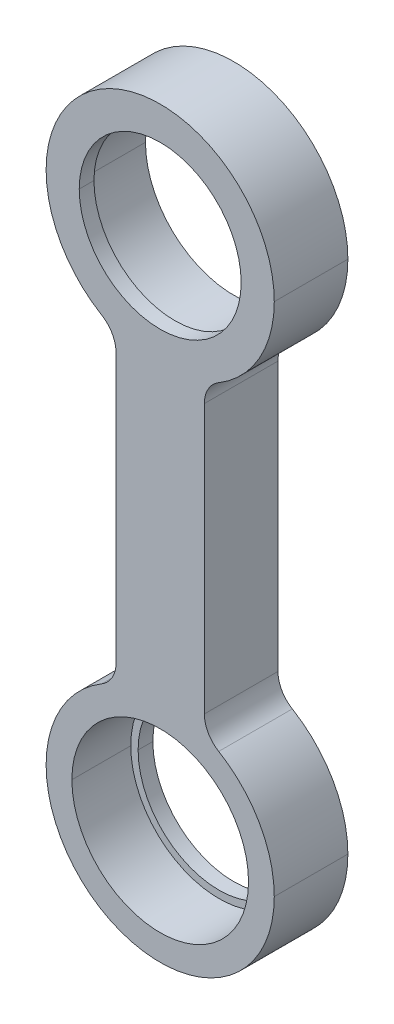
ISO-10303-21;
HEADER;
FILE_DESCRIPTION(('STEP AP214'),'2;1');
FILE_NAME('part.step','',(''),(''),'','','');
FILE_SCHEMA(('AUTOMOTIVE_DESIGN { 1 0 10303 214 1 1 1 1 }'));
ENDSEC;
DATA;
#1=APPLICATION_CONTEXT('core data for automotive mechanical design processes');
#2=APPLICATION_PROTOCOL_DEFINITION('international standard','automotive_design',2000,#1);
#3=PRODUCT_CONTEXT('',#1,'mechanical');
#4=PRODUCT('Part','Part','',(#3));
#5=PRODUCT_RELATED_PRODUCT_CATEGORY('part','',(#4));
#6=PRODUCT_DEFINITION_FORMATION('','',#4);
#7=PRODUCT_DEFINITION_CONTEXT('part definition',#1,'design');
#8=PRODUCT_DEFINITION('design','',#6,#7);
#9=PRODUCT_DEFINITION_SHAPE('','',#8);
#10=(LENGTH_UNIT() NAMED_UNIT(*) SI_UNIT(.MILLI.,.METRE.));
#11=(NAMED_UNIT(*) PLANE_ANGLE_UNIT() SI_UNIT($,.RADIAN.));
#12=(NAMED_UNIT(*) SI_UNIT($,.STERADIAN.) SOLID_ANGLE_UNIT());
#13=UNCERTAINTY_MEASURE_WITH_UNIT(LENGTH_MEASURE(1.E-05),#10,'distance_accuracy_value','');
#14=(GEOMETRIC_REPRESENTATION_CONTEXT(3) GLOBAL_UNCERTAINTY_ASSIGNED_CONTEXT((#13)) GLOBAL_UNIT_ASSIGNED_CONTEXT((#10,
#11,#12)) REPRESENTATION_CONTEXT('',''));
#15=CARTESIAN_POINT('',(0.,0.,0.));
#16=DIRECTION('',(0.,0.,1.));
#17=DIRECTION('',(1.,0.,0.));
#18=AXIS2_PLACEMENT_3D('',#15,#16,#17);
#19=CARTESIAN_POINT('',(0.,0.,1.));
#20=DIRECTION('',(0.,0.,-1.));
#21=DIRECTION('',(-1.,0.,0.));
#22=AXIS2_PLACEMENT_3D('',#19,#20,#21);
#23=CYLINDRICAL_SURFACE('',#22,5.5);
#24=DIRECTION('',(0.,0.,-1.));
#25=VECTOR('',#24,1.);
#26=CARTESIAN_POINT('',(5.5,0.,1.));
#27=LINE('',#26,#25);
#28=CARTESIAN_POINT('',(5.5,0.,1.));
#29=VERTEX_POINT('',#28);
#30=CARTESIAN_POINT('',(5.5,0.,0.));
#31=VERTEX_POINT('',#30);
#32=EDGE_CURVE('E444',#29,#31,#27,.T.);
#33=ORIENTED_EDGE('',*,*,#32,.F.);
#34=CARTESIAN_POINT('',(0.,0.,1.));
#35=DIRECTION('',(0.,0.,-1.));
#36=DIRECTION('',(-1.,0.,0.));
#37=AXIS2_PLACEMENT_3D('',#34,#35,#36);
#38=CIRCLE('',#37,5.5);
#39=CARTESIAN_POINT('',(-5.5,0.,1.));
#40=VERTEX_POINT('',#39);
#41=EDGE_CURVE('E9',#40,#29,#38,.T.);
#42=ORIENTED_EDGE('',*,*,#41,.F.);
#43=DIRECTION('',(0.,0.,-1.));
#44=VECTOR('',#43,1.);
#45=CARTESIAN_POINT('',(-5.5,0.,1.));
#46=LINE('',#45,#44);
#47=CARTESIAN_POINT('',(-5.5,0.,0.));
#48=VERTEX_POINT('',#47);
#49=EDGE_CURVE('E375',#40,#48,#46,.T.);
#50=ORIENTED_EDGE('',*,*,#49,.T.);
#51=CARTESIAN_POINT('',(0.,0.,0.));
#52=DIRECTION('',(0.,0.,-1.));
#53=DIRECTION('',(-1.,0.,0.));
#54=AXIS2_PLACEMENT_3D('',#51,#52,#53);
#55=CIRCLE('',#54,5.5);
#56=EDGE_CURVE('E339',#48,#31,#55,.T.);
#57=ORIENTED_EDGE('',*,*,#56,.T.);
#58=EDGE_LOOP('',(#33,#42,#50,#57));
#59=FACE_BOUND('',#58,.T.);
#60=ADVANCED_FACE('F15',(#59),#23,.F.);
#61=CARTESIAN_POINT('',(0.,0.,1.));
#62=DIRECTION('',(0.,0.,-1.));
#63=DIRECTION('',(0.,-1.,0.));
#64=AXIS2_PLACEMENT_3D('',#61,#62,#63);
#65=PLANE('',#64);
#66=ORIENTED_EDGE('',*,*,#41,.T.);
#67=CARTESIAN_POINT('',(0.,0.,1.));
#68=DIRECTION('',(0.,0.,-1.));
#69=DIRECTION('',(-1.,0.,0.));
#70=AXIS2_PLACEMENT_3D('',#67,#68,#69);
#71=CIRCLE('',#70,5.5);
#72=EDGE_CURVE('E440',#29,#40,#71,.T.);
#73=ORIENTED_EDGE('',*,*,#72,.T.);
#74=EDGE_LOOP('',(#66,#73));
#75=FACE_BOUND('',#74,.T.);
#76=CARTESIAN_POINT('',(0.,0.,1.));
#77=DIRECTION('',(0.,0.,-1.));
#78=DIRECTION('',(-1.,0.,0.));
#79=AXIS2_PLACEMENT_3D('',#76,#77,#78);
#80=CIRCLE('',#79,6.);
#81=CARTESIAN_POINT('',(-6.,0.,1.));
#82=VERTEX_POINT('',#81);
#83=CARTESIAN_POINT('',(6.,0.,1.));
#84=VERTEX_POINT('',#83);
#85=EDGE_CURVE('E277',#82,#84,#80,.T.);
#86=ORIENTED_EDGE('',*,*,#85,.F.);
#87=CARTESIAN_POINT('',(0.,0.,1.));
#88=DIRECTION('',(0.,0.,-1.));
#89=DIRECTION('',(-1.,0.,0.));
#90=AXIS2_PLACEMENT_3D('',#87,#88,#89);
#91=CIRCLE('',#90,6.);
#92=EDGE_CURVE('E267',#84,#82,#91,.T.);
#93=ORIENTED_EDGE('',*,*,#92,.F.);
#94=EDGE_LOOP('',(#86,#93));
#95=FACE_BOUND('',#94,.T.);
#96=ADVANCED_FACE('F469',(#75,#95),#65,.F.);
#97=CARTESIAN_POINT('',(0.,35.,4.));
#98=DIRECTION('',(0.,0.,1.));
#99=DIRECTION('',(1.,0.,0.));
#100=AXIS2_PLACEMENT_3D('',#97,#98,#99);
#101=CYLINDRICAL_SURFACE('',#100,5.5);
#102=DIRECTION('',(0.,0.,1.));
#103=VECTOR('',#102,1.);
#104=CARTESIAN_POINT('',(-5.5,35.,4.));
#105=LINE('',#104,#103);
#106=CARTESIAN_POINT('',(-5.5,35.,4.));
#107=VERTEX_POINT('',#106);
#108=CARTESIAN_POINT('',(-5.5,35.,5.));
#109=VERTEX_POINT('',#108);
#110=EDGE_CURVE('E364',#107,#109,#105,.T.);
#111=ORIENTED_EDGE('',*,*,#110,.F.);
#112=CARTESIAN_POINT('',(0.,35.,4.));
#113=DIRECTION('',(0.,0.,1.));
#114=DIRECTION('',(1.,0.,0.));
#115=AXIS2_PLACEMENT_3D('',#112,#113,#114);
#116=CIRCLE('',#115,5.5);
#117=CARTESIAN_POINT('',(5.5,35.,4.));
#118=VERTEX_POINT('',#117);
#119=EDGE_CURVE('E18',#118,#107,#116,.T.);
#120=ORIENTED_EDGE('',*,*,#119,.F.);
#121=DIRECTION('',(0.,0.,1.));
#122=VECTOR('',#121,1.);
#123=CARTESIAN_POINT('',(5.5,35.,4.));
#124=LINE('',#123,#122);
#125=CARTESIAN_POINT('',(5.5,35.,5.));
#126=VERTEX_POINT('',#125);
#127=EDGE_CURVE('E373',#118,#126,#124,.T.);
#128=ORIENTED_EDGE('',*,*,#127,.T.);
#129=CARTESIAN_POINT('',(0.,35.,5.));
#130=DIRECTION('',(0.,0.,1.));
#131=DIRECTION('',(1.,0.,0.));
#132=AXIS2_PLACEMENT_3D('',#129,#130,#131);
#133=CIRCLE('',#132,5.5);
#134=EDGE_CURVE('E308',#126,#109,#133,.T.);
#135=ORIENTED_EDGE('',*,*,#134,.T.);
#136=EDGE_LOOP('',(#111,#120,#128,#135));
#137=FACE_BOUND('',#136,.T.);
#138=ADVANCED_FACE('F365',(#137),#101,.F.);
#139=CARTESIAN_POINT('',(0.,35.,4.));
#140=DIRECTION('',(0.,0.,1.));
#141=DIRECTION('',(1.,0.,0.));
#142=AXIS2_PLACEMENT_3D('',#139,#140,#141);
#143=PLANE('',#142);
#144=ORIENTED_EDGE('',*,*,#119,.T.);
#145=CARTESIAN_POINT('',(0.,35.,4.));
#146=DIRECTION('',(0.,0.,1.));
#147=DIRECTION('',(1.,0.,0.));
#148=AXIS2_PLACEMENT_3D('',#145,#146,#147);
#149=CIRCLE('',#148,5.5);
#150=EDGE_CURVE('E359',#107,#118,#149,.T.);
#151=ORIENTED_EDGE('',*,*,#150,.T.);
#152=EDGE_LOOP('',(#144,#151));
#153=FACE_BOUND('',#152,.T.);
#154=CARTESIAN_POINT('',(0.,35.,4.));
#155=DIRECTION('',(0.,0.,1.));
#156=DIRECTION('',(1.,0.,0.));
#157=AXIS2_PLACEMENT_3D('',#154,#155,#156);
#158=CIRCLE('',#157,6.);
#159=CARTESIAN_POINT('',(-6.,35.,4.));
#160=VERTEX_POINT('',#159);
#161=CARTESIAN_POINT('',(6.,35.,4.));
#162=VERTEX_POINT('',#161);
#163=EDGE_CURVE('E243',#160,#162,#158,.T.);
#164=ORIENTED_EDGE('',*,*,#163,.F.);
#165=CARTESIAN_POINT('',(0.,35.,4.));
#166=DIRECTION('',(0.,0.,1.));
#167=DIRECTION('',(1.,0.,0.));
#168=AXIS2_PLACEMENT_3D('',#165,#166,#167);
#169=CIRCLE('',#168,6.);
#170=EDGE_CURVE('E280',#162,#160,#169,.T.);
#171=ORIENTED_EDGE('',*,*,#170,.F.);
#172=EDGE_LOOP('',(#164,#171));
#173=FACE_BOUND('',#172,.T.);
#174=ADVANCED_FACE('F356',(#153,#173),#143,.F.);
#175=CARTESIAN_POINT('',(-5.,8.3703345213916,5.));
#176=DIRECTION('',(0.,0.,-1.));
#177=DIRECTION('',(-1.,0.,0.));
#178=AXIS2_PLACEMENT_3D('',#175,#176,#177);
#179=CYLINDRICAL_SURFACE('',#178,2.);
#180=CARTESIAN_POINT('',(-5.,8.3703345213916,5.));
#181=DIRECTION('',(0.,0.,-1.));
#182=DIRECTION('',(1.,0.,0.));
#183=AXIS2_PLACEMENT_3D('',#180,#181,#182);
#184=CIRCLE('',#183,2.);
#185=CARTESIAN_POINT('',(-3.,8.3703345213916,5.));
#186=VERTEX_POINT('',#185);
#187=CARTESIAN_POINT('',(-3.97435897435898,6.65334282469589,5.));
#188=VERTEX_POINT('',#187);
#189=EDGE_CURVE('E294',#186,#188,#184,.T.);
#190=ORIENTED_EDGE('',*,*,#189,.F.);
#191=DIRECTION('',(0.,0.,1.));
#192=VECTOR('',#191,1.);
#193=CARTESIAN_POINT('',(-3.,8.3703345213916,5.));
#194=LINE('',#193,#192);
#195=CARTESIAN_POINT('',(-3.,8.3703345213916,0.));
#196=VERTEX_POINT('',#195);
#197=EDGE_CURVE('E48',#196,#186,#194,.T.);
#198=ORIENTED_EDGE('',*,*,#197,.F.);
#199=CARTESIAN_POINT('',(-5.,8.3703345213916,0.));
#200=DIRECTION('',(0.,0.,1.));
#201=DIRECTION('',(1.,0.,0.));
#202=AXIS2_PLACEMENT_3D('',#199,#200,#201);
#203=CIRCLE('',#202,2.);
#204=CARTESIAN_POINT('',(-3.97435897435898,6.65334282469589,0.));
#205=VERTEX_POINT('',#204);
#206=EDGE_CURVE('E330',#205,#196,#203,.T.);
#207=ORIENTED_EDGE('',*,*,#206,.F.);
#208=DIRECTION('',(0.,0.,-1.));
#209=VECTOR('',#208,1.);
#210=CARTESIAN_POINT('',(-3.97435897435898,6.65334282469589,5.));
#211=LINE('',#210,#209);
#212=EDGE_CURVE('E316',#188,#205,#211,.T.);
#213=ORIENTED_EDGE('',*,*,#212,.F.);
#214=EDGE_LOOP('',(#190,#198,#207,#213));
#215=FACE_BOUND('',#214,.T.);
#216=ADVANCED_FACE('F482',(#215),#179,.F.);
#217=CARTESIAN_POINT('',(5.,8.3703345213916,5.));
#218=DIRECTION('',(0.,0.,-1.));
#219=DIRECTION('',(-1.,0.,0.));
#220=AXIS2_PLACEMENT_3D('',#217,#218,#219);
#221=CYLINDRICAL_SURFACE('',#220,2.);
#222=CARTESIAN_POINT('',(5.,8.3703345213916,5.));
#223=DIRECTION('',(0.,0.,-1.));
#224=DIRECTION('',(1.,0.,0.));
#225=AXIS2_PLACEMENT_3D('',#222,#223,#224);
#226=CIRCLE('',#225,2.);
#227=CARTESIAN_POINT('',(3.97435897435898,6.65334282469589,5.));
#228=VERTEX_POINT('',#227);
#229=CARTESIAN_POINT('',(3.,8.3703345213916,5.));
#230=VERTEX_POINT('',#229);
#231=EDGE_CURVE('E293',#228,#230,#226,.T.);
#232=ORIENTED_EDGE('',*,*,#231,.F.);
#233=DIRECTION('',(0.,0.,1.));
#234=VECTOR('',#233,1.);
#235=CARTESIAN_POINT('',(3.97435897435898,6.65334282469589,5.));
#236=LINE('',#235,#234);
#237=CARTESIAN_POINT('',(3.97435897435898,6.65334282469589,0.));
#238=VERTEX_POINT('',#237);
#239=EDGE_CURVE('E388',#238,#228,#236,.T.);
#240=ORIENTED_EDGE('',*,*,#239,.F.);
#241=CARTESIAN_POINT('',(5.,8.3703345213916,0.));
#242=DIRECTION('',(0.,0.,1.));
#243=DIRECTION('',(1.,0.,0.));
#244=AXIS2_PLACEMENT_3D('',#241,#242,#243);
#245=CIRCLE('',#244,2.);
#246=CARTESIAN_POINT('',(3.,8.3703345213916,0.));
#247=VERTEX_POINT('',#246);
#248=EDGE_CURVE('E272',#247,#238,#245,.T.);
#249=ORIENTED_EDGE('',*,*,#248,.F.);
#250=DIRECTION('',(0.,0.,-1.));
#251=VECTOR('',#250,1.);
#252=CARTESIAN_POINT('',(3.,8.3703345213916,0.));
#253=LINE('',#252,#251);
#254=EDGE_CURVE('E315',#230,#247,#253,.T.);
#255=ORIENTED_EDGE('',*,*,#254,.F.);
#256=EDGE_LOOP('',(#232,#240,#249,#255));
#257=FACE_BOUND('',#256,.T.);
#258=ADVANCED_FACE('F485',(#257),#221,.F.);
#259=CARTESIAN_POINT('',(5.,26.6296654786084,5.));
#260=DIRECTION('',(0.,0.,-1.));
#261=DIRECTION('',(-1.,0.,0.));
#262=AXIS2_PLACEMENT_3D('',#259,#260,#261);
#263=CYLINDRICAL_SURFACE('',#262,2.);
#264=CARTESIAN_POINT('',(5.,26.6296654786084,5.));
#265=DIRECTION('',(0.,0.,-1.));
#266=DIRECTION('',(1.,0.,0.));
#267=AXIS2_PLACEMENT_3D('',#264,#265,#266);
#268=CIRCLE('',#267,2.);
#269=CARTESIAN_POINT('',(3.,26.6296654786084,5.));
#270=VERTEX_POINT('',#269);
#271=CARTESIAN_POINT('',(3.97435897435898,28.3466571753041,5.));
#272=VERTEX_POINT('',#271);
#273=EDGE_CURVE('E289',#270,#272,#268,.T.);
#274=ORIENTED_EDGE('',*,*,#273,.F.);
#275=DIRECTION('',(0.,0.,1.));
#276=VECTOR('',#275,1.);
#277=CARTESIAN_POINT('',(3.,26.6296654786084,5.));
#278=LINE('',#277,#276);
#279=CARTESIAN_POINT('',(3.,26.6296654786084,0.));
#280=VERTEX_POINT('',#279);
#281=EDGE_CURVE('E312',#280,#270,#278,.T.);
#282=ORIENTED_EDGE('',*,*,#281,.F.);
#283=CARTESIAN_POINT('',(5.,26.6296654786084,0.));
#284=DIRECTION('',(0.,0.,1.));
#285=DIRECTION('',(1.,0.,0.));
#286=AXIS2_PLACEMENT_3D('',#283,#284,#285);
#287=CIRCLE('',#286,2.);
#288=CARTESIAN_POINT('',(3.97435897435898,28.3466571753041,0.));
#289=VERTEX_POINT('',#288);
#290=EDGE_CURVE('E319',#289,#280,#287,.T.);
#291=ORIENTED_EDGE('',*,*,#290,.F.);
#292=DIRECTION('',(0.,0.,-1.));
#293=VECTOR('',#292,1.);
#294=CARTESIAN_POINT('',(3.97435897435898,28.3466571753041,5.));
#295=LINE('',#294,#293);
#296=EDGE_CURVE('E341',#272,#289,#295,.T.);
#297=ORIENTED_EDGE('',*,*,#296,.F.);
#298=EDGE_LOOP('',(#274,#282,#291,#297));
#299=FACE_BOUND('',#298,.T.);
#300=ADVANCED_FACE('F488',(#299),#263,.F.);
#301=CARTESIAN_POINT('',(-5.,26.6296654786084,5.));
#302=DIRECTION('',(0.,0.,-1.));
#303=DIRECTION('',(-1.,0.,0.));
#304=AXIS2_PLACEMENT_3D('',#301,#302,#303);
#305=CYLINDRICAL_SURFACE('',#304,2.);
#306=CARTESIAN_POINT('',(-5.,26.6296654786084,5.));
#307=DIRECTION('',(0.,0.,-1.));
#308=DIRECTION('',(1.,0.,0.));
#309=AXIS2_PLACEMENT_3D('',#306,#307,#308);
#310=CIRCLE('',#309,2.);
#311=CARTESIAN_POINT('',(-3.97435897435898,28.3466571753041,5.));
#312=VERTEX_POINT('',#311);
#313=CARTESIAN_POINT('',(-3.,26.6296654786084,5.));
#314=VERTEX_POINT('',#313);
#315=EDGE_CURVE('E288',#312,#314,#310,.T.);
#316=ORIENTED_EDGE('',*,*,#315,.F.);
#317=DIRECTION('',(0.,0.,1.));
#318=VECTOR('',#317,1.);
#319=CARTESIAN_POINT('',(-3.97435897435898,28.3466571753041,5.));
#320=LINE('',#319,#318);
#321=CARTESIAN_POINT('',(-3.97435897435898,28.3466571753041,0.));
#322=VERTEX_POINT('',#321);
#323=EDGE_CURVE('E215',#322,#312,#320,.T.);
#324=ORIENTED_EDGE('',*,*,#323,.F.);
#325=CARTESIAN_POINT('',(-5.,26.6296654786084,0.));
#326=DIRECTION('',(0.,0.,1.));
#327=DIRECTION('',(1.,0.,0.));
#328=AXIS2_PLACEMENT_3D('',#325,#326,#327);
#329=CIRCLE('',#328,2.);
#330=CARTESIAN_POINT('',(-3.,26.6296654786084,0.));
#331=VERTEX_POINT('',#330);
#332=EDGE_CURVE('E210',#331,#322,#329,.T.);
#333=ORIENTED_EDGE('',*,*,#332,.F.);
#334=DIRECTION('',(0.,0.,-1.));
#335=VECTOR('',#334,1.);
#336=CARTESIAN_POINT('',(-3.,26.6296654786084,0.));
#337=LINE('',#336,#335);
#338=EDGE_CURVE('E37',#314,#331,#337,.T.);
#339=ORIENTED_EDGE('',*,*,#338,.F.);
#340=EDGE_LOOP('',(#316,#324,#333,#339));
#341=FACE_BOUND('',#340,.T.);
#342=ADVANCED_FACE('F492',(#341),#305,.F.);
#343=CARTESIAN_POINT('',(3.,7.14580296397823,5.));
#344=DIRECTION('',(-1.,0.,0.));
#345=DIRECTION('',(0.,0.,1.));
#346=AXIS2_PLACEMENT_3D('',#343,#344,#345);
#347=PLANE('',#346);
#348=DIRECTION('',(0.,1.,0.));
#349=VECTOR('',#348,1.);
#350=CARTESIAN_POINT('',(3.,7.14580296397823,0.));
#351=LINE('',#350,#349);
#352=EDGE_CURVE('E276',#247,#280,#351,.T.);
#353=ORIENTED_EDGE('',*,*,#352,.T.);
#354=ORIENTED_EDGE('',*,*,#281,.T.);
#355=DIRECTION('',(0.,1.,0.));
#356=VECTOR('',#355,1.);
#357=CARTESIAN_POINT('',(3.,7.14580296397823,5.));
#358=LINE('',#357,#356);
#359=EDGE_CURVE('E396',#230,#270,#358,.T.);
#360=ORIENTED_EDGE('',*,*,#359,.F.);
#361=ORIENTED_EDGE('',*,*,#254,.T.);
#362=EDGE_LOOP('',(#353,#354,#360,#361));
#363=FACE_BOUND('',#362,.T.);
#364=ADVANCED_FACE('F496',(#363),#347,.F.);
#365=CARTESIAN_POINT('',(0.,0.,5.));
#366=DIRECTION('',(0.,0.,-1.));
#367=DIRECTION('',(-1.,0.,0.));
#368=AXIS2_PLACEMENT_3D('',#365,#366,#367);
#369=CYLINDRICAL_SURFACE('',#368,7.75);
#370=DIRECTION('',(0.,0.,-1.));
#371=VECTOR('',#370,1.);
#372=CARTESIAN_POINT('',(-7.75,0.,5.));
#373=LINE('',#372,#371);
#374=CARTESIAN_POINT('',(-7.75,0.,5.));
#375=VERTEX_POINT('',#374);
#376=CARTESIAN_POINT('',(-7.75,0.,0.));
#377=VERTEX_POINT('',#376);
#378=EDGE_CURVE('E395',#375,#377,#373,.T.);
#379=ORIENTED_EDGE('',*,*,#378,.F.);
#380=CARTESIAN_POINT('',(0.,0.,5.));
#381=DIRECTION('',(0.,0.,1.));
#382=DIRECTION('',(1.,0.,0.));
#383=AXIS2_PLACEMENT_3D('',#380,#381,#382);
#384=CIRCLE('',#383,7.75);
#385=EDGE_CURVE('E290',#188,#375,#384,.T.);
#386=ORIENTED_EDGE('',*,*,#385,.F.);
#387=ORIENTED_EDGE('',*,*,#212,.T.);
#388=CARTESIAN_POINT('',(0.,0.,0.));
#389=DIRECTION('',(0.,0.,1.));
#390=DIRECTION('',(1.,0.,0.));
#391=AXIS2_PLACEMENT_3D('',#388,#389,#390);
#392=CIRCLE('',#391,7.75);
#393=EDGE_CURVE('E275',#205,#377,#392,.T.);
#394=ORIENTED_EDGE('',*,*,#393,.T.);
#395=EDGE_LOOP('',(#379,#386,#387,#394));
#396=FACE_BOUND('',#395,.T.);
#397=ADVANCED_FACE('F426',(#396),#369,.T.);
#398=CARTESIAN_POINT('',(-3.,7.14580296397823,5.));
#399=DIRECTION('',(1.,0.,0.));
#400=DIRECTION('',(0.,1.,0.));
#401=AXIS2_PLACEMENT_3D('',#398,#399,#400);
#402=PLANE('',#401);
#403=DIRECTION('',(0.,-1.,0.));
#404=VECTOR('',#403,1.);
#405=CARTESIAN_POINT('',(-3.,7.14580296397823,5.));
#406=LINE('',#405,#404);
#407=EDGE_CURVE('E298',#314,#186,#406,.T.);
#408=ORIENTED_EDGE('',*,*,#407,.F.);
#409=ORIENTED_EDGE('',*,*,#338,.T.);
#410=DIRECTION('',(0.,-1.,0.));
#411=VECTOR('',#410,1.);
#412=CARTESIAN_POINT('',(-3.,7.14580296397823,0.));
#413=LINE('',#412,#411);
#414=EDGE_CURVE('E334',#331,#196,#413,.T.);
#415=ORIENTED_EDGE('',*,*,#414,.T.);
#416=ORIENTED_EDGE('',*,*,#197,.T.);
#417=EDGE_LOOP('',(#408,#409,#415,#416));
#418=FACE_BOUND('',#417,.T.);
#419=ADVANCED_FACE('F509',(#418),#402,.F.);
#420=CARTESIAN_POINT('',(0.,35.,5.));
#421=DIRECTION('',(0.,0.,-1.));
#422=DIRECTION('',(-1.,0.,0.));
#423=AXIS2_PLACEMENT_3D('',#420,#421,#422);
#424=CYLINDRICAL_SURFACE('',#423,7.75);
#425=DIRECTION('',(0.,0.,-1.));
#426=VECTOR('',#425,1.);
#427=CARTESIAN_POINT('',(7.75,35.,5.));
#428=LINE('',#427,#426);
#429=CARTESIAN_POINT('',(7.75,35.,5.));
#430=VERTEX_POINT('',#429);
#431=CARTESIAN_POINT('',(7.75,35.,0.));
#432=VERTEX_POINT('',#431);
#433=EDGE_CURVE('E229',#430,#432,#428,.T.);
#434=ORIENTED_EDGE('',*,*,#433,.F.);
#435=CARTESIAN_POINT('',(0.,35.,5.));
#436=DIRECTION('',(0.,0.,1.));
#437=DIRECTION('',(1.,0.,0.));
#438=AXIS2_PLACEMENT_3D('',#435,#436,#437);
#439=CIRCLE('',#438,7.75);
#440=EDGE_CURVE('E285',#272,#430,#439,.T.);
#441=ORIENTED_EDGE('',*,*,#440,.F.);
#442=ORIENTED_EDGE('',*,*,#296,.T.);
#443=CARTESIAN_POINT('',(0.,35.,0.));
#444=DIRECTION('',(0.,0.,1.));
#445=DIRECTION('',(1.,0.,0.));
#446=AXIS2_PLACEMENT_3D('',#443,#444,#445);
#447=CIRCLE('',#446,7.75);
#448=EDGE_CURVE('E311',#289,#432,#447,.T.);
#449=ORIENTED_EDGE('',*,*,#448,.T.);
#450=EDGE_LOOP('',(#434,#441,#442,#449));
#451=FACE_BOUND('',#450,.T.);
#452=ADVANCED_FACE('F507',(#451),#424,.T.);
#453=CARTESIAN_POINT('',(0.,35.,0.));
#454=DIRECTION('',(0.,0.,1.));
#455=DIRECTION('',(1.,0.,0.));
#456=AXIS2_PLACEMENT_3D('',#453,#454,#455);
#457=PLANE('',#456);
#458=ORIENTED_EDGE('',*,*,#56,.F.);
#459=CARTESIAN_POINT('',(0.,0.,0.));
#460=DIRECTION('',(0.,0.,-1.));
#461=DIRECTION('',(-1.,0.,0.));
#462=AXIS2_PLACEMENT_3D('',#459,#460,#461);
#463=CIRCLE('',#462,5.5);
#464=EDGE_CURVE('E380',#31,#48,#463,.T.);
#465=ORIENTED_EDGE('',*,*,#464,.F.);
#466=EDGE_LOOP('',(#458,#465));
#467=FACE_BOUND('',#466,.T.);
#468=CARTESIAN_POINT('',(0.,35.,0.));
#469=DIRECTION('',(0.,0.,1.));
#470=DIRECTION('',(1.,0.,0.));
#471=AXIS2_PLACEMENT_3D('',#468,#469,#470);
#472=CIRCLE('',#471,6.);
#473=CARTESIAN_POINT('',(-6.,35.,0.));
#474=VERTEX_POINT('',#473);
#475=CARTESIAN_POINT('',(6.,35.,0.));
#476=VERTEX_POINT('',#475);
#477=EDGE_CURVE('E251',#474,#476,#472,.T.);
#478=ORIENTED_EDGE('',*,*,#477,.T.);
#479=CARTESIAN_POINT('',(0.,35.,0.));
#480=DIRECTION('',(0.,0.,1.));
#481=DIRECTION('',(1.,0.,0.));
#482=AXIS2_PLACEMENT_3D('',#479,#480,#481);
#483=CIRCLE('',#482,6.);
#484=EDGE_CURVE('E284',#476,#474,#483,.T.);
#485=ORIENTED_EDGE('',*,*,#484,.T.);
#486=EDGE_LOOP('',(#478,#485));
#487=FACE_BOUND('',#486,.T.);
#488=ORIENTED_EDGE('',*,*,#448,.F.);
#489=ORIENTED_EDGE('',*,*,#290,.T.);
#490=ORIENTED_EDGE('',*,*,#352,.F.);
#491=ORIENTED_EDGE('',*,*,#248,.T.);
#492=CARTESIAN_POINT('',(0.,0.,0.));
#493=DIRECTION('',(0.,0.,1.));
#494=DIRECTION('',(1.,0.,0.));
#495=AXIS2_PLACEMENT_3D('',#492,#493,#494);
#496=CIRCLE('',#495,7.75);
#497=CARTESIAN_POINT('',(7.75,0.,0.));
#498=VERTEX_POINT('',#497);
#499=EDGE_CURVE('E384',#498,#238,#496,.T.);
#500=ORIENTED_EDGE('',*,*,#499,.F.);
#501=CARTESIAN_POINT('',(0.,0.,0.));
#502=DIRECTION('',(0.,0.,1.));
#503=DIRECTION('',(1.,0.,0.));
#504=AXIS2_PLACEMENT_3D('',#501,#502,#503);
#505=CIRCLE('',#504,7.75);
#506=EDGE_CURVE('E392',#377,#498,#505,.T.);
#507=ORIENTED_EDGE('',*,*,#506,.F.);
#508=ORIENTED_EDGE('',*,*,#393,.F.);
#509=ORIENTED_EDGE('',*,*,#206,.T.);
#510=ORIENTED_EDGE('',*,*,#414,.F.);
#511=ORIENTED_EDGE('',*,*,#332,.T.);
#512=CARTESIAN_POINT('',(0.,35.,0.));
#513=DIRECTION('',(0.,0.,1.));
#514=DIRECTION('',(1.,0.,0.));
#515=AXIS2_PLACEMENT_3D('',#512,#513,#514);
#516=CIRCLE('',#515,7.75);
#517=CARTESIAN_POINT('',(-7.75,35.,0.));
#518=VERTEX_POINT('',#517);
#519=EDGE_CURVE('E202',#518,#322,#516,.T.);
#520=ORIENTED_EDGE('',*,*,#519,.F.);
#521=CARTESIAN_POINT('',(0.,35.,0.));
#522=DIRECTION('',(0.,0.,1.));
#523=DIRECTION('',(1.,0.,0.));
#524=AXIS2_PLACEMENT_3D('',#521,#522,#523);
#525=CIRCLE('',#524,7.75);
#526=EDGE_CURVE('E207',#432,#518,#525,.T.);
#527=ORIENTED_EDGE('',*,*,#526,.F.);
#528=EDGE_LOOP('',(#488,#489,#490,#491,#500,#507,#508,#509,#510,#511,#520,#527));
#529=FACE_BOUND('',#528,.T.);
#530=ADVANCED_FACE('F205',(#467,#487,#529),#457,.F.);
#531=CARTESIAN_POINT('',(0.,35.,5.));
#532=DIRECTION('',(0.,0.,1.));
#533=DIRECTION('',(1.,0.,0.));
#534=AXIS2_PLACEMENT_3D('',#531,#532,#533);
#535=PLANE('',#534);
#536=ORIENTED_EDGE('',*,*,#134,.F.);
#537=CARTESIAN_POINT('',(0.,35.,5.));
#538=DIRECTION('',(0.,0.,1.));
#539=DIRECTION('',(1.,0.,0.));
#540=AXIS2_PLACEMENT_3D('',#537,#538,#539);
#541=CIRCLE('',#540,5.5);
#542=EDGE_CURVE('E370',#109,#126,#541,.T.);
#543=ORIENTED_EDGE('',*,*,#542,.F.);
#544=EDGE_LOOP('',(#536,#543));
#545=FACE_BOUND('',#544,.T.);
#546=CARTESIAN_POINT('',(0.,0.,5.));
#547=DIRECTION('',(0.,0.,1.));
#548=DIRECTION('',(1.,0.,0.));
#549=AXIS2_PLACEMENT_3D('',#546,#547,#548);
#550=CIRCLE('',#549,6.);
#551=CARTESIAN_POINT('',(-6.,0.,5.));
#552=VERTEX_POINT('',#551);
#553=CARTESIAN_POINT('',(6.,0.,5.));
#554=VERTEX_POINT('',#553);
#555=EDGE_CURVE('E259',#552,#554,#550,.T.);
#556=ORIENTED_EDGE('',*,*,#555,.F.);
#557=CARTESIAN_POINT('',(0.,0.,5.));
#558=DIRECTION('',(0.,0.,1.));
#559=DIRECTION('',(1.,0.,0.));
#560=AXIS2_PLACEMENT_3D('',#557,#558,#559);
#561=CIRCLE('',#560,6.);
#562=EDGE_CURVE('E281',#554,#552,#561,.T.);
#563=ORIENTED_EDGE('',*,*,#562,.F.);
#564=EDGE_LOOP('',(#556,#563));
#565=FACE_BOUND('',#564,.T.);
#566=ORIENTED_EDGE('',*,*,#359,.T.);
#567=ORIENTED_EDGE('',*,*,#273,.T.);
#568=ORIENTED_EDGE('',*,*,#440,.T.);
#569=CARTESIAN_POINT('',(0.,35.,5.));
#570=DIRECTION('',(0.,0.,1.));
#571=DIRECTION('',(1.,0.,0.));
#572=AXIS2_PLACEMENT_3D('',#569,#570,#571);
#573=CIRCLE('',#572,7.75);
#574=CARTESIAN_POINT('',(-7.75,35.,5.));
#575=VERTEX_POINT('',#574);
#576=EDGE_CURVE('E235',#430,#575,#573,.T.);
#577=ORIENTED_EDGE('',*,*,#576,.T.);
#578=CARTESIAN_POINT('',(0.,35.,5.));
#579=DIRECTION('',(0.,0.,1.));
#580=DIRECTION('',(1.,0.,0.));
#581=AXIS2_PLACEMENT_3D('',#578,#579,#580);
#582=CIRCLE('',#581,7.75);
#583=EDGE_CURVE('E216',#575,#312,#582,.T.);
#584=ORIENTED_EDGE('',*,*,#583,.T.);
#585=ORIENTED_EDGE('',*,*,#315,.T.);
#586=ORIENTED_EDGE('',*,*,#407,.T.);
#587=ORIENTED_EDGE('',*,*,#189,.T.);
#588=ORIENTED_EDGE('',*,*,#385,.T.);
#589=CARTESIAN_POINT('',(0.,0.,5.));
#590=DIRECTION('',(0.,0.,1.));
#591=DIRECTION('',(1.,0.,0.));
#592=AXIS2_PLACEMENT_3D('',#589,#590,#591);
#593=CIRCLE('',#592,7.75);
#594=CARTESIAN_POINT('',(7.75,0.,5.));
#595=VERTEX_POINT('',#594);
#596=EDGE_CURVE('E412',#375,#595,#593,.T.);
#597=ORIENTED_EDGE('',*,*,#596,.T.);
#598=CARTESIAN_POINT('',(0.,0.,5.));
#599=DIRECTION('',(0.,0.,1.));
#600=DIRECTION('',(1.,0.,0.));
#601=AXIS2_PLACEMENT_3D('',#598,#599,#600);
#602=CIRCLE('',#601,7.75);
#603=EDGE_CURVE('E405',#595,#228,#602,.T.);
#604=ORIENTED_EDGE('',*,*,#603,.T.);
#605=ORIENTED_EDGE('',*,*,#231,.T.);
#606=EDGE_LOOP('',(#566,#567,#568,#577,#584,#585,#586,#587,#588,#597,#604,#605));
#607=FACE_BOUND('',#606,.T.);
#608=ADVANCED_FACE('F500',(#545,#565,#607),#535,.T.);
#609=CARTESIAN_POINT('',(0.,35.,5.));
#610=DIRECTION('',(0.,0.,-1.));
#611=DIRECTION('',(-1.,0.,0.));
#612=AXIS2_PLACEMENT_3D('',#609,#610,#611);
#613=CYLINDRICAL_SURFACE('',#612,6.);
#614=DIRECTION('',(0.,0.,-1.));
#615=VECTOR('',#614,1.);
#616=CARTESIAN_POINT('',(6.,35.,5.));
#617=LINE('',#616,#615);
#618=EDGE_CURVE('E247',#162,#476,#617,.T.);
#619=ORIENTED_EDGE('',*,*,#618,.F.);
#620=ORIENTED_EDGE('',*,*,#170,.T.);
#621=DIRECTION('',(0.,0.,-1.));
#622=VECTOR('',#621,1.);
#623=CARTESIAN_POINT('',(-6.,35.,5.));
#624=LINE('',#623,#622);
#625=EDGE_CURVE('E255',#160,#474,#624,.T.);
#626=ORIENTED_EDGE('',*,*,#625,.T.);
#627=ORIENTED_EDGE('',*,*,#484,.F.);
#628=EDGE_LOOP('',(#619,#620,#626,#627));
#629=FACE_BOUND('',#628,.T.);
#630=ADVANCED_FACE('F503',(#629),#613,.F.);
#631=CARTESIAN_POINT('',(0.,0.,5.));
#632=DIRECTION('',(0.,0.,-1.));
#633=DIRECTION('',(-1.,0.,0.));
#634=AXIS2_PLACEMENT_3D('',#631,#632,#633);
#635=CYLINDRICAL_SURFACE('',#634,6.);
#636=DIRECTION('',(0.,0.,-1.));
#637=VECTOR('',#636,1.);
#638=CARTESIAN_POINT('',(6.,0.,5.));
#639=LINE('',#638,#637);
#640=EDGE_CURVE('E263',#554,#84,#639,.T.);
#641=ORIENTED_EDGE('',*,*,#640,.F.);
#642=ORIENTED_EDGE('',*,*,#562,.T.);
#643=DIRECTION('',(0.,0.,-1.));
#644=VECTOR('',#643,1.);
#645=CARTESIAN_POINT('',(-6.,0.,5.));
#646=LINE('',#645,#644);
#647=EDGE_CURVE('E271',#552,#82,#646,.T.);
#648=ORIENTED_EDGE('',*,*,#647,.T.);
#649=ORIENTED_EDGE('',*,*,#85,.T.);
#650=EDGE_LOOP('',(#641,#642,#648,#649));
#651=FACE_BOUND('',#650,.T.);
#652=ADVANCED_FACE('F463',(#651),#635,.F.);
#653=CARTESIAN_POINT('',(0.,0.,5.));
#654=DIRECTION('',(0.,0.,-1.));
#655=DIRECTION('',(-1.,0.,0.));
#656=AXIS2_PLACEMENT_3D('',#653,#654,#655);
#657=CYLINDRICAL_SURFACE('',#656,6.);
#658=ORIENTED_EDGE('',*,*,#555,.T.);
#659=ORIENTED_EDGE('',*,*,#640,.T.);
#660=ORIENTED_EDGE('',*,*,#92,.T.);
#661=ORIENTED_EDGE('',*,*,#647,.F.);
#662=EDGE_LOOP('',(#658,#659,#660,#661));
#663=FACE_BOUND('',#662,.T.);
#664=ADVANCED_FACE('F467',(#663),#657,.F.);
#665=CARTESIAN_POINT('',(0.,35.,5.));
#666=DIRECTION('',(0.,0.,-1.));
#667=DIRECTION('',(-1.,0.,0.));
#668=AXIS2_PLACEMENT_3D('',#665,#666,#667);
#669=CYLINDRICAL_SURFACE('',#668,6.);
#670=ORIENTED_EDGE('',*,*,#163,.T.);
#671=ORIENTED_EDGE('',*,*,#618,.T.);
#672=ORIENTED_EDGE('',*,*,#477,.F.);
#673=ORIENTED_EDGE('',*,*,#625,.F.);
#674=EDGE_LOOP('',(#670,#671,#672,#673));
#675=FACE_BOUND('',#674,.T.);
#676=ADVANCED_FACE('F515',(#675),#669,.F.);
#677=CARTESIAN_POINT('',(0.,35.,5.));
#678=DIRECTION('',(0.,0.,-1.));
#679=DIRECTION('',(-1.,0.,0.));
#680=AXIS2_PLACEMENT_3D('',#677,#678,#679);
#681=CYLINDRICAL_SURFACE('',#680,7.75);
#682=ORIENTED_EDGE('',*,*,#583,.F.);
#683=DIRECTION('',(0.,0.,-1.));
#684=VECTOR('',#683,1.);
#685=CARTESIAN_POINT('',(-7.75,35.,5.));
#686=LINE('',#685,#684);
#687=EDGE_CURVE('E219',#575,#518,#686,.T.);
#688=ORIENTED_EDGE('',*,*,#687,.T.);
#689=ORIENTED_EDGE('',*,*,#519,.T.);
#690=ORIENTED_EDGE('',*,*,#323,.T.);
#691=EDGE_LOOP('',(#682,#688,#689,#690));
#692=FACE_BOUND('',#691,.T.);
#693=ADVANCED_FACE('F220',(#692),#681,.T.);
#694=CARTESIAN_POINT('',(0.,35.,5.));
#695=DIRECTION('',(0.,0.,-1.));
#696=DIRECTION('',(-1.,0.,0.));
#697=AXIS2_PLACEMENT_3D('',#694,#695,#696);
#698=CYLINDRICAL_SURFACE('',#697,7.75);
#699=ORIENTED_EDGE('',*,*,#576,.F.);
#700=ORIENTED_EDGE('',*,*,#433,.T.);
#701=ORIENTED_EDGE('',*,*,#526,.T.);
#702=ORIENTED_EDGE('',*,*,#687,.F.);
#703=EDGE_LOOP('',(#699,#700,#701,#702));
#704=FACE_BOUND('',#703,.T.);
#705=ADVANCED_FACE('F227',(#704),#698,.T.);
#706=CARTESIAN_POINT('',(0.,0.,5.));
#707=DIRECTION('',(0.,0.,-1.));
#708=DIRECTION('',(-1.,0.,0.));
#709=AXIS2_PLACEMENT_3D('',#706,#707,#708);
#710=CYLINDRICAL_SURFACE('',#709,7.75);
#711=DIRECTION('',(0.,0.,-1.));
#712=VECTOR('',#711,1.);
#713=CARTESIAN_POINT('',(7.75,0.,5.));
#714=LINE('',#713,#712);
#715=EDGE_CURVE('E389',#595,#498,#714,.T.);
#716=ORIENTED_EDGE('',*,*,#715,.F.);
#717=ORIENTED_EDGE('',*,*,#596,.F.);
#718=ORIENTED_EDGE('',*,*,#378,.T.);
#719=ORIENTED_EDGE('',*,*,#506,.T.);
#720=EDGE_LOOP('',(#716,#717,#718,#719));
#721=FACE_BOUND('',#720,.T.);
#722=ADVANCED_FACE('F421',(#721),#710,.T.);
#723=CARTESIAN_POINT('',(0.,0.,5.));
#724=DIRECTION('',(0.,0.,-1.));
#725=DIRECTION('',(-1.,0.,0.));
#726=AXIS2_PLACEMENT_3D('',#723,#724,#725);
#727=CYLINDRICAL_SURFACE('',#726,7.75);
#728=ORIENTED_EDGE('',*,*,#603,.F.);
#729=ORIENTED_EDGE('',*,*,#715,.T.);
#730=ORIENTED_EDGE('',*,*,#499,.T.);
#731=ORIENTED_EDGE('',*,*,#239,.T.);
#732=EDGE_LOOP('',(#728,#729,#730,#731));
#733=FACE_BOUND('',#732,.T.);
#734=ADVANCED_FACE('F432',(#733),#727,.T.);
#735=CARTESIAN_POINT('',(0.,35.,4.));
#736=DIRECTION('',(0.,0.,1.));
#737=DIRECTION('',(1.,0.,0.));
#738=AXIS2_PLACEMENT_3D('',#735,#736,#737);
#739=CYLINDRICAL_SURFACE('',#738,5.5);
#740=ORIENTED_EDGE('',*,*,#150,.F.);
#741=ORIENTED_EDGE('',*,*,#110,.T.);
#742=ORIENTED_EDGE('',*,*,#542,.T.);
#743=ORIENTED_EDGE('',*,*,#127,.F.);
#744=EDGE_LOOP('',(#740,#741,#742,#743));
#745=FACE_BOUND('',#744,.T.);
#746=ADVANCED_FACE('F372',(#745),#739,.F.);
#747=CARTESIAN_POINT('',(0.,0.,1.));
#748=DIRECTION('',(0.,0.,-1.));
#749=DIRECTION('',(-1.,0.,0.));
#750=AXIS2_PLACEMENT_3D('',#747,#748,#749);
#751=CYLINDRICAL_SURFACE('',#750,5.5);
#752=ORIENTED_EDGE('',*,*,#72,.F.);
#753=ORIENTED_EDGE('',*,*,#32,.T.);
#754=ORIENTED_EDGE('',*,*,#464,.T.);
#755=ORIENTED_EDGE('',*,*,#49,.F.);
#756=EDGE_LOOP('',(#752,#753,#754,#755));
#757=FACE_BOUND('',#756,.T.);
#758=ADVANCED_FACE('F534',(#757),#751,.F.);
#759=CLOSED_SHELL('',(#60,#96,#138,#174,#216,#258,#300,#342,#364,#397,#419,#452,#530,#608,#630,
#652,#664,#676,#693,#705,#722,#734,#746,#758));
#760=MANIFOLD_SOLID_BREP('B1',#759);
#761=ADVANCED_BREP_SHAPE_REPRESENTATION('',(#18,#760),#14);
#762=SHAPE_DEFINITION_REPRESENTATION(#9,#761);
ENDSEC;
END-ISO-10303-21;
